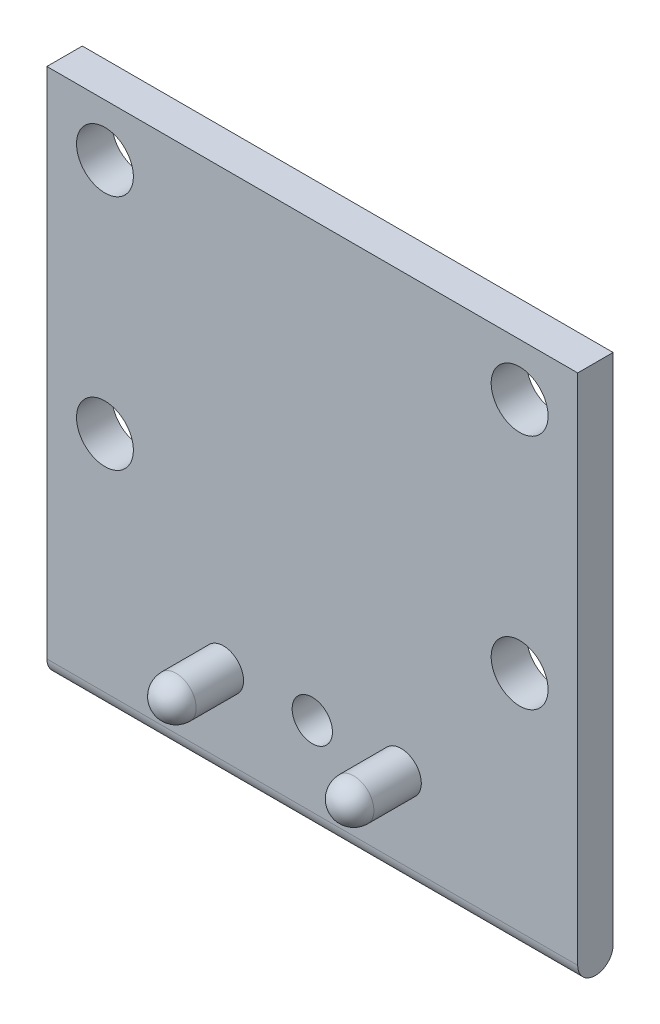
ISO-10303-21;
HEADER;
FILE_DESCRIPTION(('STEP AP214'),'2;1');
FILE_NAME('part.step','',(''),(''),'','','');
FILE_SCHEMA(('AUTOMOTIVE_DESIGN { 1 0 10303 214 1 1 1 1 }'));
ENDSEC;
DATA;
#1=APPLICATION_CONTEXT('core data for automotive mechanical design processes');
#2=APPLICATION_PROTOCOL_DEFINITION('international standard','automotive_design',2000,#1);
#3=PRODUCT_CONTEXT('',#1,'mechanical');
#4=PRODUCT('Part','Part','',(#3));
#5=PRODUCT_RELATED_PRODUCT_CATEGORY('part','',(#4));
#6=PRODUCT_DEFINITION_FORMATION('','',#4);
#7=PRODUCT_DEFINITION_CONTEXT('part definition',#1,'design');
#8=PRODUCT_DEFINITION('design','',#6,#7);
#9=PRODUCT_DEFINITION_SHAPE('','',#8);
#10=(LENGTH_UNIT() NAMED_UNIT(*) SI_UNIT(.MILLI.,.METRE.));
#11=(NAMED_UNIT(*) PLANE_ANGLE_UNIT() SI_UNIT($,.RADIAN.));
#12=(NAMED_UNIT(*) SI_UNIT($,.STERADIAN.) SOLID_ANGLE_UNIT());
#13=UNCERTAINTY_MEASURE_WITH_UNIT(LENGTH_MEASURE(1.E-05),#10,'distance_accuracy_value','');
#14=(GEOMETRIC_REPRESENTATION_CONTEXT(3) GLOBAL_UNCERTAINTY_ASSIGNED_CONTEXT((#13)) GLOBAL_UNIT_ASSIGNED_CONTEXT((#10,
#11,#12)) REPRESENTATION_CONTEXT('',''));
#15=CARTESIAN_POINT('',(0.,0.,0.));
#16=DIRECTION('',(0.,0.,1.));
#17=DIRECTION('',(1.,0.,0.));
#18=AXIS2_PLACEMENT_3D('',#15,#16,#17);
#19=CARTESIAN_POINT('',(-22.4,1.495,0.));
#20=DIRECTION('',(1.,0.,0.));
#21=DIRECTION('',(0.,0.,-1.));
#22=AXIS2_PLACEMENT_3D('',#19,#20,#21);
#23=CYLINDRICAL_SURFACE('',#22,1.495);
#24=DIRECTION('',(-1.,0.,0.));
#25=VECTOR('',#24,1.);
#26=CARTESIAN_POINT('',(-22.4,1.495,1.495));
#27=LINE('',#26,#25);
#28=CARTESIAN_POINT('',(-22.4,1.495,1.495));
#29=VERTEX_POINT('',#28);
#30=CARTESIAN_POINT('',(22.4,1.495,1.495));
#31=VERTEX_POINT('',#30);
#32=EDGE_CURVE('E106',#29,#31,#27,.F.);
#33=ORIENTED_EDGE('',*,*,#32,.F.);
#34=CARTESIAN_POINT('',(-22.4,1.495,0.));
#35=DIRECTION('',(1.,0.,0.));
#36=DIRECTION('',(0.,0.,-1.));
#37=AXIS2_PLACEMENT_3D('',#34,#35,#36);
#38=CIRCLE('',#37,1.495);
#39=CARTESIAN_POINT('',(-22.4,1.495,-1.495));
#40=VERTEX_POINT('',#39);
#41=EDGE_CURVE('E67',#40,#29,#38,.F.);
#42=ORIENTED_EDGE('',*,*,#41,.F.);
#43=DIRECTION('',(-1.,0.,0.));
#44=VECTOR('',#43,1.);
#45=CARTESIAN_POINT('',(-22.4,1.495,-1.495));
#46=LINE('',#45,#44);
#47=CARTESIAN_POINT('',(22.4,1.495,-1.495));
#48=VERTEX_POINT('',#47);
#49=EDGE_CURVE('E109',#48,#40,#46,.T.);
#50=ORIENTED_EDGE('',*,*,#49,.F.);
#51=CARTESIAN_POINT('',(22.4,1.495,0.));
#52=DIRECTION('',(-1.,0.,0.));
#53=DIRECTION('',(0.,0.,1.));
#54=AXIS2_PLACEMENT_3D('',#51,#52,#53);
#55=CIRCLE('',#54,1.495);
#56=EDGE_CURVE('E60',#31,#48,#55,.F.);
#57=ORIENTED_EDGE('',*,*,#56,.F.);
#58=EDGE_LOOP('',(#33,#42,#50,#57));
#59=FACE_BOUND('',#58,.T.);
#60=ADVANCED_FACE('F45',(#59),#23,.T.);
#61=CARTESIAN_POINT('',(22.4,44.8,1.495));
#62=DIRECTION('',(-1.,0.,0.));
#63=DIRECTION('',(0.,0.,1.));
#64=AXIS2_PLACEMENT_3D('',#61,#62,#63);
#65=PLANE('',#64);
#66=DIRECTION('',(0.,-1.,0.));
#67=VECTOR('',#66,1.);
#68=CARTESIAN_POINT('',(22.4,44.8,1.495));
#69=LINE('',#68,#67);
#70=CARTESIAN_POINT('',(22.4,44.8,1.495));
#71=VERTEX_POINT('',#70);
#72=EDGE_CURVE('E151',#71,#31,#69,.T.);
#73=ORIENTED_EDGE('',*,*,#72,.T.);
#74=ORIENTED_EDGE('',*,*,#56,.T.);
#75=DIRECTION('',(0.,-1.,0.));
#76=VECTOR('',#75,1.);
#77=CARTESIAN_POINT('',(22.4,44.8,-1.495));
#78=LINE('',#77,#76);
#79=CARTESIAN_POINT('',(22.4,44.8,-1.495));
#80=VERTEX_POINT('',#79);
#81=EDGE_CURVE('E90',#80,#48,#78,.T.);
#82=ORIENTED_EDGE('',*,*,#81,.F.);
#83=DIRECTION('',(0.,0.,-1.));
#84=VECTOR('',#83,1.);
#85=CARTESIAN_POINT('',(22.4,44.8,1.495));
#86=LINE('',#85,#84);
#87=EDGE_CURVE('E96',#71,#80,#86,.T.);
#88=ORIENTED_EDGE('',*,*,#87,.F.);
#89=EDGE_LOOP('',(#73,#74,#82,#88));
#90=FACE_BOUND('',#89,.T.);
#91=ADVANCED_FACE('F105',(#90),#65,.F.);
#92=CARTESIAN_POINT('',(-22.4,44.8,-1.495));
#93=DIRECTION('',(0.,0.,1.));
#94=DIRECTION('',(1.,0.,0.));
#95=AXIS2_PLACEMENT_3D('',#92,#93,#94);
#96=PLANE('',#95);
#97=CARTESIAN_POINT('',(0.,8.2,-1.495));
#98=DIRECTION('',(0.,0.,1.));
#99=DIRECTION('',(1.,0.,0.));
#100=AXIS2_PLACEMENT_3D('',#97,#98,#99);
#101=CIRCLE('',#100,1.7);
#102=CARTESIAN_POINT('',(1.7,8.2,-1.495));
#103=VERTEX_POINT('',#102);
#104=EDGE_CURVE('E171',#103,#103,#101,.T.);
#105=ORIENTED_EDGE('',*,*,#104,.T.);
#106=EDGE_LOOP('',(#105));
#107=FACE_BOUND('',#106,.T.);
#108=CARTESIAN_POINT('',(-17.5,40.4,-1.495));
#109=DIRECTION('',(0.,0.,1.));
#110=DIRECTION('',(1.,0.,0.));
#111=AXIS2_PLACEMENT_3D('',#108,#109,#110);
#112=CIRCLE('',#111,2.39999999999999);
#113=CARTESIAN_POINT('',(-15.1,40.4,-1.495));
#114=VERTEX_POINT('',#113);
#115=EDGE_CURVE('E167',#114,#114,#112,.T.);
#116=ORIENTED_EDGE('',*,*,#115,.T.);
#117=EDGE_LOOP('',(#116));
#118=FACE_BOUND('',#117,.T.);
#119=CARTESIAN_POINT('',(-17.5,20.4,-1.495));
#120=DIRECTION('',(0.,0.,1.));
#121=DIRECTION('',(1.,0.,0.));
#122=AXIS2_PLACEMENT_3D('',#119,#120,#121);
#123=CIRCLE('',#122,2.39999999999999);
#124=CARTESIAN_POINT('',(-15.1,20.4,-1.495));
#125=VERTEX_POINT('',#124);
#126=EDGE_CURVE('E163',#125,#125,#123,.T.);
#127=ORIENTED_EDGE('',*,*,#126,.T.);
#128=EDGE_LOOP('',(#127));
#129=FACE_BOUND('',#128,.T.);
#130=CARTESIAN_POINT('',(17.5,20.4,-1.495));
#131=DIRECTION('',(0.,0.,1.));
#132=DIRECTION('',(1.,0.,0.));
#133=AXIS2_PLACEMENT_3D('',#130,#131,#132);
#134=CIRCLE('',#133,2.39999999999999);
#135=CARTESIAN_POINT('',(19.9,20.4,-1.495));
#136=VERTEX_POINT('',#135);
#137=EDGE_CURVE('E159',#136,#136,#134,.T.);
#138=ORIENTED_EDGE('',*,*,#137,.T.);
#139=EDGE_LOOP('',(#138));
#140=FACE_BOUND('',#139,.T.);
#141=CARTESIAN_POINT('',(17.5,40.4,-1.495));
#142=DIRECTION('',(0.,0.,1.));
#143=DIRECTION('',(1.,0.,0.));
#144=AXIS2_PLACEMENT_3D('',#141,#142,#143);
#145=CIRCLE('',#144,2.39999999999999);
#146=CARTESIAN_POINT('',(19.9,40.4,-1.495));
#147=VERTEX_POINT('',#146);
#148=EDGE_CURVE('E103',#147,#147,#145,.T.);
#149=ORIENTED_EDGE('',*,*,#148,.T.);
#150=EDGE_LOOP('',(#149));
#151=FACE_BOUND('',#150,.T.);
#152=ORIENTED_EDGE('',*,*,#81,.T.);
#153=ORIENTED_EDGE('',*,*,#49,.T.);
#154=DIRECTION('',(0.,-1.,0.));
#155=VECTOR('',#154,1.);
#156=CARTESIAN_POINT('',(-22.4,44.8,-1.495));
#157=LINE('',#156,#155);
#158=CARTESIAN_POINT('',(-22.4,44.8,-1.495));
#159=VERTEX_POINT('',#158);
#160=EDGE_CURVE('E92',#159,#40,#157,.T.);
#161=ORIENTED_EDGE('',*,*,#160,.F.);
#162=DIRECTION('',(-1.,0.,0.));
#163=VECTOR('',#162,1.);
#164=CARTESIAN_POINT('',(-22.4,44.8,-1.495));
#165=LINE('',#164,#163);
#166=EDGE_CURVE('E87',#80,#159,#165,.T.);
#167=ORIENTED_EDGE('',*,*,#166,.F.);
#168=EDGE_LOOP('',(#152,#153,#161,#167));
#169=FACE_BOUND('',#168,.T.);
#170=ADVANCED_FACE('F89',(#107,#118,#129,#140,#151,#169),#96,.F.);
#171=CARTESIAN_POINT('',(-22.4,44.8,1.495));
#172=DIRECTION('',(1.,0.,0.));
#173=DIRECTION('',(0.,0.,-1.));
#174=AXIS2_PLACEMENT_3D('',#171,#172,#173);
#175=PLANE('',#174);
#176=ORIENTED_EDGE('',*,*,#160,.T.);
#177=ORIENTED_EDGE('',*,*,#41,.T.);
#178=DIRECTION('',(0.,-1.,0.));
#179=VECTOR('',#178,1.);
#180=CARTESIAN_POINT('',(-22.4,44.8,1.495));
#181=LINE('',#180,#179);
#182=CARTESIAN_POINT('',(-22.4,44.8,1.495));
#183=VERTEX_POINT('',#182);
#184=EDGE_CURVE('E111',#183,#29,#181,.T.);
#185=ORIENTED_EDGE('',*,*,#184,.F.);
#186=DIRECTION('',(0.,0.,1.));
#187=VECTOR('',#186,1.);
#188=CARTESIAN_POINT('',(-22.4,44.8,1.495));
#189=LINE('',#188,#187);
#190=EDGE_CURVE('E95',#159,#183,#189,.T.);
#191=ORIENTED_EDGE('',*,*,#190,.F.);
#192=EDGE_LOOP('',(#176,#177,#185,#191));
#193=FACE_BOUND('',#192,.T.);
#194=ADVANCED_FACE('F125',(#193),#175,.F.);
#195=CARTESIAN_POINT('',(-22.4,44.8,1.495));
#196=DIRECTION('',(0.,0.,-1.));
#197=DIRECTION('',(-1.,0.,0.));
#198=AXIS2_PLACEMENT_3D('',#195,#196,#197);
#199=PLANE('',#198);
#200=CARTESIAN_POINT('',(-7.5,8.2,1.495));
#201=DIRECTION('',(0.,0.,-1.));
#202=DIRECTION('',(-1.,0.,0.));
#203=AXIS2_PLACEMENT_3D('',#200,#201,#202);
#204=CIRCLE('',#203,1.7);
#205=CARTESIAN_POINT('',(-9.2,8.2,1.495));
#206=VERTEX_POINT('',#205);
#207=EDGE_CURVE('E11',#206,#206,#204,.F.);
#208=ORIENTED_EDGE('',*,*,#207,.F.);
#209=EDGE_LOOP('',(#208));
#210=FACE_BOUND('',#209,.T.);
#211=CARTESIAN_POINT('',(7.5,8.2,1.495));
#212=DIRECTION('',(0.,0.,-1.));
#213=DIRECTION('',(-1.,0.,0.));
#214=AXIS2_PLACEMENT_3D('',#211,#212,#213);
#215=CIRCLE('',#214,1.7);
#216=CARTESIAN_POINT('',(5.8,8.2,1.495));
#217=VERTEX_POINT('',#216);
#218=EDGE_CURVE('E53',#217,#217,#215,.F.);
#219=ORIENTED_EDGE('',*,*,#218,.F.);
#220=EDGE_LOOP('',(#219));
#221=FACE_BOUND('',#220,.T.);
#222=CARTESIAN_POINT('',(0.,8.2,1.495));
#223=DIRECTION('',(0.,0.,1.));
#224=DIRECTION('',(1.,0.,0.));
#225=AXIS2_PLACEMENT_3D('',#222,#223,#224);
#226=CIRCLE('',#225,1.7);
#227=CARTESIAN_POINT('',(1.7,8.2,1.495));
#228=VERTEX_POINT('',#227);
#229=EDGE_CURVE('E131',#228,#228,#226,.T.);
#230=ORIENTED_EDGE('',*,*,#229,.F.);
#231=EDGE_LOOP('',(#230));
#232=FACE_BOUND('',#231,.T.);
#233=CARTESIAN_POINT('',(-17.5,40.4,1.495));
#234=DIRECTION('',(0.,0.,1.));
#235=DIRECTION('',(1.,0.,0.));
#236=AXIS2_PLACEMENT_3D('',#233,#234,#235);
#237=CIRCLE('',#236,2.39999999999999);
#238=CARTESIAN_POINT('',(-15.1,40.4,1.495));
#239=VERTEX_POINT('',#238);
#240=EDGE_CURVE('E135',#239,#239,#237,.T.);
#241=ORIENTED_EDGE('',*,*,#240,.F.);
#242=EDGE_LOOP('',(#241));
#243=FACE_BOUND('',#242,.T.);
#244=CARTESIAN_POINT('',(-17.5,20.4,1.495));
#245=DIRECTION('',(0.,0.,1.));
#246=DIRECTION('',(1.,0.,0.));
#247=AXIS2_PLACEMENT_3D('',#244,#245,#246);
#248=CIRCLE('',#247,2.39999999999999);
#249=CARTESIAN_POINT('',(-15.1,20.4,1.495));
#250=VERTEX_POINT('',#249);
#251=EDGE_CURVE('E139',#250,#250,#248,.T.);
#252=ORIENTED_EDGE('',*,*,#251,.F.);
#253=EDGE_LOOP('',(#252));
#254=FACE_BOUND('',#253,.T.);
#255=CARTESIAN_POINT('',(17.5,20.4,1.495));
#256=DIRECTION('',(0.,0.,1.));
#257=DIRECTION('',(1.,0.,0.));
#258=AXIS2_PLACEMENT_3D('',#255,#256,#257);
#259=CIRCLE('',#258,2.39999999999999);
#260=CARTESIAN_POINT('',(19.9,20.4,1.495));
#261=VERTEX_POINT('',#260);
#262=EDGE_CURVE('E143',#261,#261,#259,.T.);
#263=ORIENTED_EDGE('',*,*,#262,.F.);
#264=EDGE_LOOP('',(#263));
#265=FACE_BOUND('',#264,.T.);
#266=CARTESIAN_POINT('',(17.5,40.4,1.495));
#267=DIRECTION('',(0.,0.,1.));
#268=DIRECTION('',(1.,0.,0.));
#269=AXIS2_PLACEMENT_3D('',#266,#267,#268);
#270=CIRCLE('',#269,2.39999999999999);
#271=CARTESIAN_POINT('',(19.9,40.4,1.495));
#272=VERTEX_POINT('',#271);
#273=EDGE_CURVE('E147',#272,#272,#270,.T.);
#274=ORIENTED_EDGE('',*,*,#273,.F.);
#275=EDGE_LOOP('',(#274));
#276=FACE_BOUND('',#275,.T.);
#277=ORIENTED_EDGE('',*,*,#184,.T.);
#278=ORIENTED_EDGE('',*,*,#32,.T.);
#279=ORIENTED_EDGE('',*,*,#72,.F.);
#280=DIRECTION('',(1.,0.,0.));
#281=VECTOR('',#280,1.);
#282=CARTESIAN_POINT('',(-22.4,44.8,1.495));
#283=LINE('',#282,#281);
#284=EDGE_CURVE('E101',#183,#71,#283,.T.);
#285=ORIENTED_EDGE('',*,*,#284,.F.);
#286=EDGE_LOOP('',(#277,#278,#279,#285));
#287=FACE_BOUND('',#286,.T.);
#288=ADVANCED_FACE('F122',(#210,#221,#232,#243,#254,#265,#276,#287),#199,.F.);
#289=CARTESIAN_POINT('',(0.,44.8,0.));
#290=DIRECTION('',(0.,-1.,0.));
#291=DIRECTION('',(0.,0.,-1.));
#292=AXIS2_PLACEMENT_3D('',#289,#290,#291);
#293=PLANE('',#292);
#294=ORIENTED_EDGE('',*,*,#87,.T.);
#295=ORIENTED_EDGE('',*,*,#166,.T.);
#296=ORIENTED_EDGE('',*,*,#190,.T.);
#297=ORIENTED_EDGE('',*,*,#284,.T.);
#298=EDGE_LOOP('',(#294,#295,#296,#297));
#299=FACE_BOUND('',#298,.T.);
#300=ADVANCED_FACE('F99',(#299),#293,.F.);
#301=CARTESIAN_POINT('',(17.5,40.4,1.495));
#302=DIRECTION('',(0.,0.,1.));
#303=DIRECTION('',(1.,0.,0.));
#304=AXIS2_PLACEMENT_3D('',#301,#302,#303);
#305=CYLINDRICAL_SURFACE('',#304,2.39999999999999);
#306=ORIENTED_EDGE('',*,*,#148,.F.);
#307=EDGE_LOOP('',(#306));
#308=FACE_BOUND('',#307,.T.);
#309=ORIENTED_EDGE('',*,*,#273,.T.);
#310=EDGE_LOOP('',(#309));
#311=FACE_BOUND('',#310,.T.);
#312=ADVANCED_FACE('F213',(#308,#311),#305,.F.);
#313=CARTESIAN_POINT('',(17.5,20.4,1.495));
#314=DIRECTION('',(0.,0.,1.));
#315=DIRECTION('',(1.,0.,0.));
#316=AXIS2_PLACEMENT_3D('',#313,#314,#315);
#317=CYLINDRICAL_SURFACE('',#316,2.39999999999999);
#318=ORIENTED_EDGE('',*,*,#137,.F.);
#319=EDGE_LOOP('',(#318));
#320=FACE_BOUND('',#319,.T.);
#321=ORIENTED_EDGE('',*,*,#262,.T.);
#322=EDGE_LOOP('',(#321));
#323=FACE_BOUND('',#322,.T.);
#324=ADVANCED_FACE('F215',(#320,#323),#317,.F.);
#325=CARTESIAN_POINT('',(-17.5,20.4,1.495));
#326=DIRECTION('',(0.,0.,1.));
#327=DIRECTION('',(1.,0.,0.));
#328=AXIS2_PLACEMENT_3D('',#325,#326,#327);
#329=CYLINDRICAL_SURFACE('',#328,2.39999999999999);
#330=ORIENTED_EDGE('',*,*,#126,.F.);
#331=EDGE_LOOP('',(#330));
#332=FACE_BOUND('',#331,.T.);
#333=ORIENTED_EDGE('',*,*,#251,.T.);
#334=EDGE_LOOP('',(#333));
#335=FACE_BOUND('',#334,.T.);
#336=ADVANCED_FACE('F219',(#332,#335),#329,.F.);
#337=CARTESIAN_POINT('',(-17.5,40.4,1.495));
#338=DIRECTION('',(0.,0.,1.));
#339=DIRECTION('',(1.,0.,0.));
#340=AXIS2_PLACEMENT_3D('',#337,#338,#339);
#341=CYLINDRICAL_SURFACE('',#340,2.39999999999999);
#342=ORIENTED_EDGE('',*,*,#115,.F.);
#343=EDGE_LOOP('',(#342));
#344=FACE_BOUND('',#343,.T.);
#345=ORIENTED_EDGE('',*,*,#240,.T.);
#346=EDGE_LOOP('',(#345));
#347=FACE_BOUND('',#346,.T.);
#348=ADVANCED_FACE('F223',(#344,#347),#341,.F.);
#349=CARTESIAN_POINT('',(0.,8.2,1.495));
#350=DIRECTION('',(0.,0.,1.));
#351=DIRECTION('',(1.,0.,0.));
#352=AXIS2_PLACEMENT_3D('',#349,#350,#351);
#353=CYLINDRICAL_SURFACE('',#352,1.7);
#354=ORIENTED_EDGE('',*,*,#104,.F.);
#355=EDGE_LOOP('',(#354));
#356=FACE_BOUND('',#355,.T.);
#357=ORIENTED_EDGE('',*,*,#229,.T.);
#358=EDGE_LOOP('',(#357));
#359=FACE_BOUND('',#358,.T.);
#360=ADVANCED_FACE('F195',(#356,#359),#353,.F.);
#361=CARTESIAN_POINT('',(7.5,8.2,5.495));
#362=DIRECTION('',(0.,0.,-1.));
#363=DIRECTION('',(-1.,0.,0.));
#364=AXIS2_PLACEMENT_3D('',#361,#362,#363);
#365=CYLINDRICAL_SURFACE('',#364,1.7);
#366=CARTESIAN_POINT('',(7.5,8.2,5.495));
#367=DIRECTION('',(0.,0.,1.));
#368=DIRECTION('',(1.,0.,0.));
#369=AXIS2_PLACEMENT_3D('',#366,#367,#368);
#370=CIRCLE('',#369,1.7);
#371=CARTESIAN_POINT('',(9.2,8.2,5.495));
#372=VERTEX_POINT('',#371);
#373=EDGE_CURVE('E176',#372,#372,#370,.T.);
#374=ORIENTED_EDGE('',*,*,#373,.F.);
#375=EDGE_LOOP('',(#374));
#376=FACE_BOUND('',#375,.T.);
#377=ORIENTED_EDGE('',*,*,#218,.T.);
#378=EDGE_LOOP('',(#377));
#379=FACE_BOUND('',#378,.T.);
#380=ADVANCED_FACE('F120',(#376,#379),#365,.T.);
#381=CARTESIAN_POINT('',(-7.5,8.2,5.495));
#382=DIRECTION('',(0.,0.,-1.));
#383=DIRECTION('',(-1.,0.,0.));
#384=AXIS2_PLACEMENT_3D('',#381,#382,#383);
#385=CYLINDRICAL_SURFACE('',#384,1.7);
#386=CARTESIAN_POINT('',(-7.5,8.2,5.495));
#387=DIRECTION('',(0.,0.,1.));
#388=DIRECTION('',(1.,0.,0.));
#389=AXIS2_PLACEMENT_3D('',#386,#387,#388);
#390=CIRCLE('',#389,1.7);
#391=CARTESIAN_POINT('',(-5.8,8.2,5.495));
#392=VERTEX_POINT('',#391);
#393=EDGE_CURVE('E175',#392,#392,#390,.T.);
#394=ORIENTED_EDGE('',*,*,#393,.F.);
#395=EDGE_LOOP('',(#394));
#396=FACE_BOUND('',#395,.T.);
#397=ORIENTED_EDGE('',*,*,#207,.T.);
#398=EDGE_LOOP('',(#397));
#399=FACE_BOUND('',#398,.T.);
#400=ADVANCED_FACE('F184',(#396,#399),#385,.T.);
#401=CARTESIAN_POINT('',(-7.5,8.2,5.495));
#402=DIRECTION('',(0.,1.,0.));
#403=DIRECTION('',(-1.,0.,0.));
#404=AXIS2_PLACEMENT_3D('',#401,#402,#403);
#405=SPHERICAL_SURFACE('',#404,1.7);
#406=CARTESIAN_POINT('',(-7.5,8.2,5.495));
#407=DIRECTION('',(0.,0.,1.));
#408=DIRECTION('',(1.,0.,0.));
#409=AXIS2_PLACEMENT_3D('',#406,#407,#408);
#410=SPHERICAL_SURFACE('',#409,1.7);
#411=ORIENTED_EDGE('',*,*,#393,.T.);
#412=EDGE_LOOP('',(#411));
#413=FACE_BOUND('',#412,.T.);
#414=ADVANCED_FACE('F182',(#413),#410,.T.);
#415=CARTESIAN_POINT('',(7.5,8.2,5.495));
#416=DIRECTION('',(0.,1.,0.));
#417=DIRECTION('',(-1.,0.,0.));
#418=AXIS2_PLACEMENT_3D('',#415,#416,#417);
#419=SPHERICAL_SURFACE('',#418,1.7);
#420=CARTESIAN_POINT('',(7.5,8.2,5.495));
#421=DIRECTION('',(0.,0.,1.));
#422=DIRECTION('',(1.,0.,0.));
#423=AXIS2_PLACEMENT_3D('',#420,#421,#422);
#424=SPHERICAL_SURFACE('',#423,1.7);
#425=ORIENTED_EDGE('',*,*,#373,.T.);
#426=EDGE_LOOP('',(#425));
#427=FACE_BOUND('',#426,.T.);
#428=ADVANCED_FACE('F193',(#427),#424,.T.);
#429=CLOSED_SHELL('',(#60,#91,#170,#194,#288,#300,#312,#324,#336,#348,#360,#380,#400,#414,#428));
#430=MANIFOLD_SOLID_BREP('B2',#429);
#431=ADVANCED_BREP_SHAPE_REPRESENTATION('',(#18,#430),#14);
#432=SHAPE_DEFINITION_REPRESENTATION(#9,#431);
ENDSEC;
END-ISO-10303-21;
